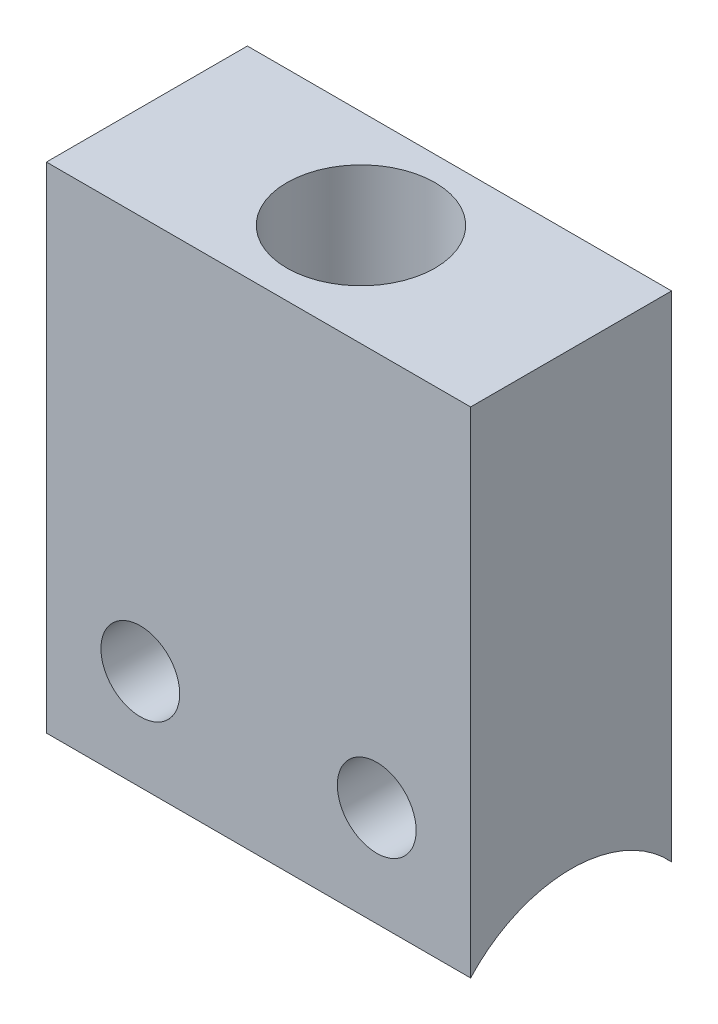
ISO-10303-21;
HEADER;
FILE_DESCRIPTION(('STEP AP214'),'2;1');
FILE_NAME('part.step','',(''),(''),'','','');
FILE_SCHEMA(('AUTOMOTIVE_DESIGN { 1 0 10303 214 1 1 1 1 }'));
ENDSEC;
DATA;
#1=APPLICATION_CONTEXT('core data for automotive mechanical design processes');
#2=APPLICATION_PROTOCOL_DEFINITION('international standard','automotive_design',2000,#1);
#3=PRODUCT_CONTEXT('',#1,'mechanical');
#4=PRODUCT('Part','Part','',(#3));
#5=PRODUCT_RELATED_PRODUCT_CATEGORY('part','',(#4));
#6=PRODUCT_DEFINITION_FORMATION('','',#4);
#7=PRODUCT_DEFINITION_CONTEXT('part definition',#1,'design');
#8=PRODUCT_DEFINITION('design','',#6,#7);
#9=PRODUCT_DEFINITION_SHAPE('','',#8);
#10=(LENGTH_UNIT() NAMED_UNIT(*) SI_UNIT(.MILLI.,.METRE.));
#11=(NAMED_UNIT(*) PLANE_ANGLE_UNIT() SI_UNIT($,.RADIAN.));
#12=(NAMED_UNIT(*) SI_UNIT($,.STERADIAN.) SOLID_ANGLE_UNIT());
#13=UNCERTAINTY_MEASURE_WITH_UNIT(LENGTH_MEASURE(1.E-05),#10,'distance_accuracy_value','');
#14=(GEOMETRIC_REPRESENTATION_CONTEXT(3) GLOBAL_UNCERTAINTY_ASSIGNED_CONTEXT((#13)) GLOBAL_UNIT_ASSIGNED_CONTEXT((#10,
#11,#12)) REPRESENTATION_CONTEXT('',''));
#15=CARTESIAN_POINT('',(0.,0.,0.));
#16=DIRECTION('',(0.,0.,1.));
#17=DIRECTION('',(1.,0.,0.));
#18=AXIS2_PLACEMENT_3D('',#15,#16,#17);
#19=CARTESIAN_POINT('',(10.765,15.,10.2));
#20=DIRECTION('',(-1.,0.,0.));
#21=DIRECTION('',(0.,-1.,0.));
#22=AXIS2_PLACEMENT_3D('',#19,#20,#21);
#23=PLANE('',#22);
#24=CARTESIAN_POINT('',(10.765,-14.757402076161,5.1));
#25=DIRECTION('',(1.,0.,0.));
#26=DIRECTION('',(0.,1.,0.));
#27=AXIS2_PLACEMENT_3D('',#24,#25,#26);
#28=CIRCLE('',#27,6.90642240839313);
#29=CARTESIAN_POINT('',(10.765,-10.1002924056513,10.2));
#30=VERTEX_POINT('',#29);
#31=CARTESIAN_POINT('',(10.765,-10.1002924056513,0.));
#32=VERTEX_POINT('',#31);
#33=EDGE_CURVE('E124',#30,#32,#28,.F.);
#34=ORIENTED_EDGE('',*,*,#33,.T.);
#35=DIRECTION('',(0.,1.,0.));
#36=VECTOR('',#35,1.);
#37=CARTESIAN_POINT('',(10.765,15.,0.));
#38=LINE('',#37,#36);
#39=CARTESIAN_POINT('',(10.765,15.,0.));
#40=VERTEX_POINT('',#39);
#41=EDGE_CURVE('E91',#32,#40,#38,.T.);
#42=ORIENTED_EDGE('',*,*,#41,.T.);
#43=DIRECTION('',(0.,0.,-1.));
#44=VECTOR('',#43,1.);
#45=CARTESIAN_POINT('',(10.765,15.,10.2));
#46=LINE('',#45,#44);
#47=CARTESIAN_POINT('',(10.765,15.,10.2));
#48=VERTEX_POINT('',#47);
#49=EDGE_CURVE('E11',#48,#40,#46,.T.);
#50=ORIENTED_EDGE('',*,*,#49,.F.);
#51=DIRECTION('',(0.,1.,0.));
#52=VECTOR('',#51,1.);
#53=CARTESIAN_POINT('',(10.765,15.,10.2));
#54=LINE('',#53,#52);
#55=EDGE_CURVE('E101',#30,#48,#54,.T.);
#56=ORIENTED_EDGE('',*,*,#55,.F.);
#57=EDGE_LOOP('',(#34,#42,#50,#56));
#58=FACE_BOUND('',#57,.T.);
#59=ADVANCED_FACE('F45',(#58),#23,.F.);
#60=CARTESIAN_POINT('',(-10.765,15.,10.2));
#61=DIRECTION('',(1.,0.,0.));
#62=DIRECTION('',(0.,1.,0.));
#63=AXIS2_PLACEMENT_3D('',#60,#61,#62);
#64=PLANE('',#63);
#65=CARTESIAN_POINT('',(-10.765,-14.757402076161,5.1));
#66=DIRECTION('',(1.,0.,0.));
#67=DIRECTION('',(0.,1.,0.));
#68=AXIS2_PLACEMENT_3D('',#65,#66,#67);
#69=CIRCLE('',#68,6.90642240839313);
#70=CARTESIAN_POINT('',(-10.765,-10.1002924056513,0.));
#71=VERTEX_POINT('',#70);
#72=CARTESIAN_POINT('',(-10.765,-10.1002924056513,10.2));
#73=VERTEX_POINT('',#72);
#74=EDGE_CURVE('E60',#71,#73,#69,.T.);
#75=ORIENTED_EDGE('',*,*,#74,.T.);
#76=DIRECTION('',(0.,-1.,0.));
#77=VECTOR('',#76,1.);
#78=CARTESIAN_POINT('',(-10.765,15.,10.2));
#79=LINE('',#78,#77);
#80=CARTESIAN_POINT('',(-10.765,15.,10.2));
#81=VERTEX_POINT('',#80);
#82=EDGE_CURVE('E96',#81,#73,#79,.T.);
#83=ORIENTED_EDGE('',*,*,#82,.F.);
#84=DIRECTION('',(0.,0.,-1.));
#85=VECTOR('',#84,1.);
#86=CARTESIAN_POINT('',(-10.765,15.,10.2));
#87=LINE('',#86,#85);
#88=CARTESIAN_POINT('',(-10.765,15.,0.));
#89=VERTEX_POINT('',#88);
#90=EDGE_CURVE('E53',#81,#89,#87,.T.);
#91=ORIENTED_EDGE('',*,*,#90,.T.);
#92=DIRECTION('',(0.,-1.,0.));
#93=VECTOR('',#92,1.);
#94=CARTESIAN_POINT('',(-10.765,15.,0.));
#95=LINE('',#94,#93);
#96=EDGE_CURVE('E90',#89,#71,#95,.T.);
#97=ORIENTED_EDGE('',*,*,#96,.T.);
#98=EDGE_LOOP('',(#75,#83,#91,#97));
#99=FACE_BOUND('',#98,.T.);
#100=ADVANCED_FACE('F95',(#99),#64,.F.);
#101=CARTESIAN_POINT('',(0.,0.,10.2));
#102=DIRECTION('',(0.,0.,1.));
#103=DIRECTION('',(1.,0.,0.));
#104=AXIS2_PLACEMENT_3D('',#101,#102,#103);
#105=PLANE('',#104);
#106=CARTESIAN_POINT('',(-6.,-5.,10.2));
#107=DIRECTION('',(0.,0.,1.));
#108=DIRECTION('',(1.,0.,0.));
#109=AXIS2_PLACEMENT_3D('',#106,#107,#108);
#110=CIRCLE('',#109,2.);
#111=CARTESIAN_POINT('',(-4.,-5.,10.2));
#112=VERTEX_POINT('',#111);
#113=EDGE_CURVE('E137',#112,#112,#110,.T.);
#114=ORIENTED_EDGE('',*,*,#113,.F.);
#115=EDGE_LOOP('',(#114));
#116=FACE_BOUND('',#115,.T.);
#117=CARTESIAN_POINT('',(6.,-5.,10.2));
#118=DIRECTION('',(0.,0.,1.));
#119=DIRECTION('',(-1.,0.,0.));
#120=AXIS2_PLACEMENT_3D('',#117,#118,#119);
#121=CIRCLE('',#120,2.);
#122=CARTESIAN_POINT('',(4.,-5.,10.2));
#123=VERTEX_POINT('',#122);
#124=EDGE_CURVE('E133',#123,#123,#121,.T.);
#125=ORIENTED_EDGE('',*,*,#124,.F.);
#126=EDGE_LOOP('',(#125));
#127=FACE_BOUND('',#126,.T.);
#128=ORIENTED_EDGE('',*,*,#82,.T.);
#129=DIRECTION('',(1.,0.,0.));
#130=VECTOR('',#129,1.);
#131=CARTESIAN_POINT('',(-10.766,-10.1002924056513,10.2));
#132=LINE('',#131,#130);
#133=EDGE_CURVE('E120',#73,#30,#132,.T.);
#134=ORIENTED_EDGE('',*,*,#133,.T.);
#135=ORIENTED_EDGE('',*,*,#55,.T.);
#136=DIRECTION('',(-1.,0.,0.));
#137=VECTOR('',#136,1.);
#138=CARTESIAN_POINT('',(-10.765,15.,10.2));
#139=LINE('',#138,#137);
#140=EDGE_CURVE('E69',#48,#81,#139,.T.);
#141=ORIENTED_EDGE('',*,*,#140,.T.);
#142=EDGE_LOOP('',(#128,#134,#135,#141));
#143=FACE_BOUND('',#142,.T.);
#144=ADVANCED_FACE('F152',(#116,#127,#143),#105,.T.);
#145=CARTESIAN_POINT('',(0.,0.,0.));
#146=DIRECTION('',(0.,0.,1.));
#147=DIRECTION('',(1.,0.,0.));
#148=AXIS2_PLACEMENT_3D('',#145,#146,#147);
#149=PLANE('',#148);
#150=CARTESIAN_POINT('',(-6.,-5.,0.));
#151=DIRECTION('',(0.,0.,1.));
#152=DIRECTION('',(1.,0.,0.));
#153=AXIS2_PLACEMENT_3D('',#150,#151,#152);
#154=CIRCLE('',#153,2.);
#155=CARTESIAN_POINT('',(-4.,-5.,0.));
#156=VERTEX_POINT('',#155);
#157=EDGE_CURVE('E132',#156,#156,#154,.F.);
#158=ORIENTED_EDGE('',*,*,#157,.F.);
#159=EDGE_LOOP('',(#158));
#160=FACE_BOUND('',#159,.T.);
#161=CARTESIAN_POINT('',(6.,-5.,0.));
#162=DIRECTION('',(0.,0.,1.));
#163=DIRECTION('',(1.,0.,0.));
#164=AXIS2_PLACEMENT_3D('',#161,#162,#163);
#165=CIRCLE('',#164,2.);
#166=CARTESIAN_POINT('',(8.,-5.,0.));
#167=VERTEX_POINT('',#166);
#168=EDGE_CURVE('E138',#167,#167,#165,.F.);
#169=ORIENTED_EDGE('',*,*,#168,.F.);
#170=EDGE_LOOP('',(#169));
#171=FACE_BOUND('',#170,.T.);
#172=DIRECTION('',(1.,0.,0.));
#173=VECTOR('',#172,1.);
#174=CARTESIAN_POINT('',(-10.766,-10.1002924056513,0.));
#175=LINE('',#174,#173);
#176=EDGE_CURVE('E99',#71,#32,#175,.T.);
#177=ORIENTED_EDGE('',*,*,#176,.F.);
#178=ORIENTED_EDGE('',*,*,#96,.F.);
#179=DIRECTION('',(-1.,0.,0.));
#180=VECTOR('',#179,1.);
#181=CARTESIAN_POINT('',(-10.765,15.,0.));
#182=LINE('',#181,#180);
#183=EDGE_CURVE('E81',#40,#89,#182,.T.);
#184=ORIENTED_EDGE('',*,*,#183,.F.);
#185=ORIENTED_EDGE('',*,*,#41,.F.);
#186=EDGE_LOOP('',(#177,#178,#184,#185));
#187=FACE_BOUND('',#186,.T.);
#188=ADVANCED_FACE('F98',(#160,#171,#187),#149,.F.);
#189=CARTESIAN_POINT('',(-10.765,15.,10.2));
#190=DIRECTION('',(0.,-1.,0.));
#191=DIRECTION('',(0.,0.,-1.));
#192=AXIS2_PLACEMENT_3D('',#189,#190,#191);
#193=PLANE('',#192);
#194=CARTESIAN_POINT('',(0.,15.,5.));
#195=DIRECTION('',(0.,1.,0.));
#196=DIRECTION('',(0.,0.,1.));
#197=AXIS2_PLACEMENT_3D('',#194,#195,#196);
#198=CIRCLE('',#197,3.76);
#199=CARTESIAN_POINT('',(0.,15.,8.76));
#200=VERTEX_POINT('',#199);
#201=EDGE_CURVE('E113',#200,#200,#198,.T.);
#202=ORIENTED_EDGE('',*,*,#201,.F.);
#203=EDGE_LOOP('',(#202));
#204=FACE_BOUND('',#203,.T.);
#205=ORIENTED_EDGE('',*,*,#183,.T.);
#206=ORIENTED_EDGE('',*,*,#90,.F.);
#207=ORIENTED_EDGE('',*,*,#140,.F.);
#208=ORIENTED_EDGE('',*,*,#49,.T.);
#209=EDGE_LOOP('',(#205,#206,#207,#208));
#210=FACE_BOUND('',#209,.T.);
#211=ADVANCED_FACE('F83',(#204,#210),#193,.F.);
#212=CARTESIAN_POINT('',(0.,5.,5.));
#213=DIRECTION('',(0.,1.,0.));
#214=DIRECTION('',(0.,0.,1.));
#215=AXIS2_PLACEMENT_3D('',#212,#213,#214);
#216=CYLINDRICAL_SURFACE('',#215,3.76);
#217=CARTESIAN_POINT('',(0.,5.,5.));
#218=DIRECTION('',(0.,1.,0.));
#219=DIRECTION('',(0.,0.,1.));
#220=AXIS2_PLACEMENT_3D('',#217,#218,#219);
#221=CIRCLE('',#220,3.76);
#222=CARTESIAN_POINT('',(0.,5.,8.76));
#223=VERTEX_POINT('',#222);
#224=EDGE_CURVE('E108',#223,#223,#221,.T.);
#225=ORIENTED_EDGE('',*,*,#224,.F.);
#226=EDGE_LOOP('',(#225));
#227=FACE_BOUND('',#226,.T.);
#228=ORIENTED_EDGE('',*,*,#201,.T.);
#229=EDGE_LOOP('',(#228));
#230=FACE_BOUND('',#229,.T.);
#231=ADVANCED_FACE('F176',(#227,#230),#216,.F.);
#232=CARTESIAN_POINT('',(0.,5.,5.));
#233=DIRECTION('',(0.,1.,0.));
#234=DIRECTION('',(0.,0.,1.));
#235=AXIS2_PLACEMENT_3D('',#232,#233,#234);
#236=PLANE('',#235);
#237=ORIENTED_EDGE('',*,*,#224,.T.);
#238=EDGE_LOOP('',(#237));
#239=FACE_BOUND('',#238,.T.);
#240=ADVANCED_FACE('F181',(#239),#236,.T.);
#241=CARTESIAN_POINT('',(-10.766,-14.757402076161,5.1));
#242=DIRECTION('',(1.,0.,0.));
#243=DIRECTION('',(0.,1.,0.));
#244=AXIS2_PLACEMENT_3D('',#241,#242,#243);
#245=CYLINDRICAL_SURFACE('',#244,6.90642240839313);
#246=ORIENTED_EDGE('',*,*,#176,.T.);
#247=ORIENTED_EDGE('',*,*,#33,.F.);
#248=ORIENTED_EDGE('',*,*,#133,.F.);
#249=ORIENTED_EDGE('',*,*,#74,.F.);
#250=EDGE_LOOP('',(#246,#247,#248,#249));
#251=FACE_BOUND('',#250,.T.);
#252=ADVANCED_FACE('F163',(#251),#245,.F.);
#253=CARTESIAN_POINT('',(6.,-5.,-0.000999999999999265));
#254=DIRECTION('',(0.,0.,1.));
#255=DIRECTION('',(1.,0.,0.));
#256=AXIS2_PLACEMENT_3D('',#253,#254,#255);
#257=CYLINDRICAL_SURFACE('',#256,2.);
#258=ORIENTED_EDGE('',*,*,#124,.T.);
#259=EDGE_LOOP('',(#258));
#260=FACE_BOUND('',#259,.T.);
#261=ORIENTED_EDGE('',*,*,#168,.T.);
#262=EDGE_LOOP('',(#261));
#263=FACE_BOUND('',#262,.T.);
#264=ADVANCED_FACE('F195',(#260,#263),#257,.F.);
#265=CARTESIAN_POINT('',(-6.,-5.,-0.000999999999999265));
#266=DIRECTION('',(0.,0.,1.));
#267=DIRECTION('',(1.,0.,0.));
#268=AXIS2_PLACEMENT_3D('',#265,#266,#267);
#269=CYLINDRICAL_SURFACE('',#268,2.);
#270=ORIENTED_EDGE('',*,*,#113,.T.);
#271=EDGE_LOOP('',(#270));
#272=FACE_BOUND('',#271,.T.);
#273=ORIENTED_EDGE('',*,*,#157,.T.);
#274=EDGE_LOOP('',(#273));
#275=FACE_BOUND('',#274,.T.);
#276=ADVANCED_FACE('F149',(#272,#275),#269,.F.);
#277=CLOSED_SHELL('',(#59,#100,#144,#188,#211,#231,#240,#252,#264,#276));
#278=MANIFOLD_SOLID_BREP('B2',#277);
#279=ADVANCED_BREP_SHAPE_REPRESENTATION('',(#18,#278),#14);
#280=SHAPE_DEFINITION_REPRESENTATION(#9,#279);
ENDSEC;
END-ISO-10303-21;
